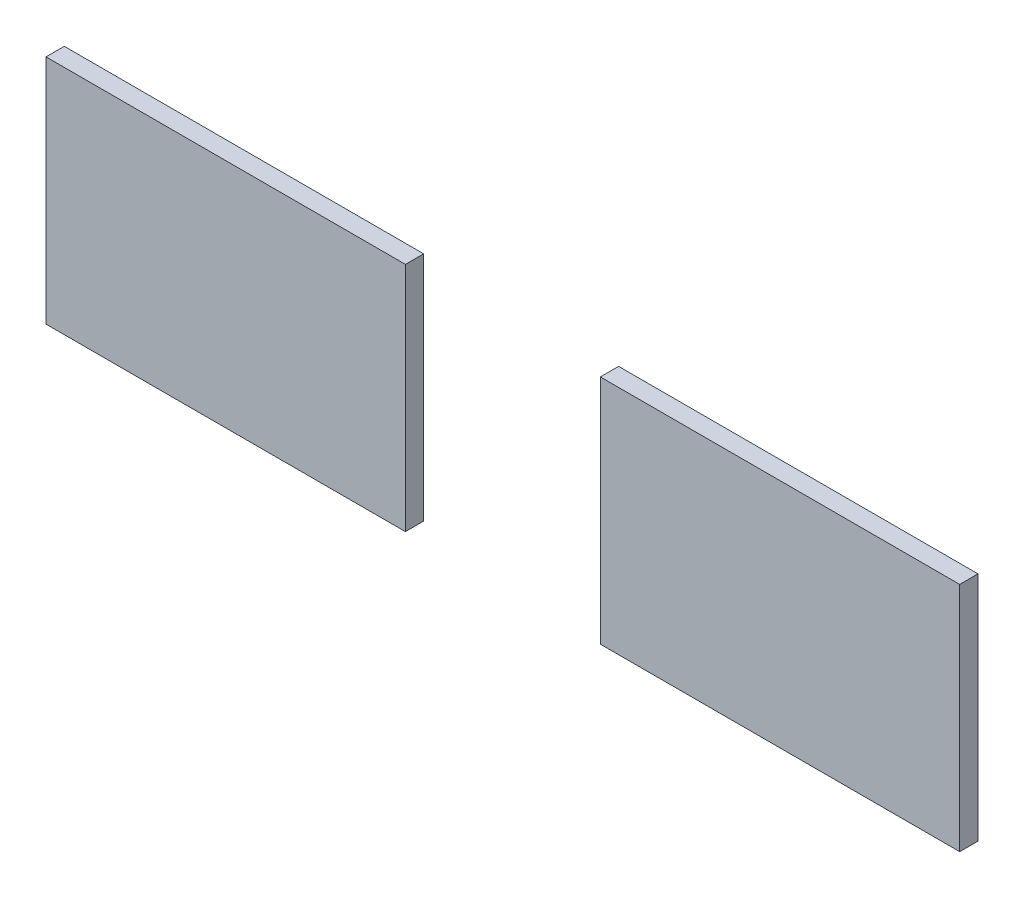
ISO-10303-21;
HEADER;
FILE_DESCRIPTION(('STEP AP214'),'2;1');
FILE_NAME('part.step','',(''),(''),'','','');
FILE_SCHEMA(('AUTOMOTIVE_DESIGN { 1 0 10303 214 1 1 1 1 }'));
ENDSEC;
DATA;
#1=APPLICATION_CONTEXT('core data for automotive mechanical design processes');
#2=APPLICATION_PROTOCOL_DEFINITION('international standard','automotive_design',2000,#1);
#3=PRODUCT_CONTEXT('',#1,'mechanical');
#4=PRODUCT('Part','Part','',(#3));
#5=PRODUCT_RELATED_PRODUCT_CATEGORY('part','',(#4));
#6=PRODUCT_DEFINITION_FORMATION('','',#4);
#7=PRODUCT_DEFINITION_CONTEXT('part definition',#1,'design');
#8=PRODUCT_DEFINITION('design','',#6,#7);
#9=PRODUCT_DEFINITION_SHAPE('','',#8);
#10=(LENGTH_UNIT() NAMED_UNIT(*) SI_UNIT(.MILLI.,.METRE.));
#11=(NAMED_UNIT(*) PLANE_ANGLE_UNIT() SI_UNIT($,.RADIAN.));
#12=(NAMED_UNIT(*) SI_UNIT($,.STERADIAN.) SOLID_ANGLE_UNIT());
#13=UNCERTAINTY_MEASURE_WITH_UNIT(LENGTH_MEASURE(1.E-05),#10,'distance_accuracy_value','');
#14=(GEOMETRIC_REPRESENTATION_CONTEXT(3) GLOBAL_UNCERTAINTY_ASSIGNED_CONTEXT((#13)) GLOBAL_UNIT_ASSIGNED_CONTEXT((#10,
#11,#12)) REPRESENTATION_CONTEXT('',''));
#15=CARTESIAN_POINT('',(0.,0.,0.));
#16=DIRECTION('',(0.,0.,1.));
#17=DIRECTION('',(1.,0.,0.));
#18=AXIS2_PLACEMENT_3D('',#15,#16,#17);
#19=CARTESIAN_POINT('',(-18.8636363636364,9.16666666666666,1.5));
#20=DIRECTION('',(1.,0.,0.));
#21=DIRECTION('',(0.,0.,-1.));
#22=AXIS2_PLACEMENT_3D('',#19,#20,#21);
#23=PLANE('',#22);
#24=DIRECTION('',(0.,-1.,0.));
#25=VECTOR('',#24,1.);
#26=CARTESIAN_POINT('',(-18.8636363636364,9.16666666666666,0.));
#27=LINE('',#26,#25);
#28=CARTESIAN_POINT('',(-18.8636363636364,9.16666666666666,0.));
#29=VERTEX_POINT('',#28);
#30=CARTESIAN_POINT('',(-18.8636363636364,-9.83333333333334,0.));
#31=VERTEX_POINT('',#30);
#32=EDGE_CURVE('E107',#29,#31,#27,.T.);
#33=ORIENTED_EDGE('',*,*,#32,.T.);
#34=DIRECTION('',(0.,0.,-1.));
#35=VECTOR('',#34,1.);
#36=CARTESIAN_POINT('',(-18.8636363636364,-9.83333333333334,1.5));
#37=LINE('',#36,#35);
#38=CARTESIAN_POINT('',(-18.8636363636364,-9.83333333333334,1.5));
#39=VERTEX_POINT('',#38);
#40=EDGE_CURVE('E12',#39,#31,#37,.T.);
#41=ORIENTED_EDGE('',*,*,#40,.F.);
#42=DIRECTION('',(0.,-1.,0.));
#43=VECTOR('',#42,1.);
#44=CARTESIAN_POINT('',(-18.8636363636364,9.16666666666666,1.5));
#45=LINE('',#44,#43);
#46=CARTESIAN_POINT('',(-18.8636363636364,9.16666666666666,1.5));
#47=VERTEX_POINT('',#46);
#48=EDGE_CURVE('E95',#47,#39,#45,.T.);
#49=ORIENTED_EDGE('',*,*,#48,.F.);
#50=DIRECTION('',(0.,0.,-1.));
#51=VECTOR('',#50,1.);
#52=CARTESIAN_POINT('',(-18.8636363636364,9.16666666666666,1.5));
#53=LINE('',#52,#51);
#54=EDGE_CURVE('E103',#47,#29,#53,.T.);
#55=ORIENTED_EDGE('',*,*,#54,.T.);
#56=EDGE_LOOP('',(#33,#41,#49,#55));
#57=FACE_BOUND('',#56,.T.);
#58=ADVANCED_FACE('F44',(#57),#23,.F.);
#59=CARTESIAN_POINT('',(-18.8636363636364,-9.83333333333334,1.5));
#60=DIRECTION('',(0.,1.,0.));
#61=DIRECTION('',(-1.,0.,0.));
#62=AXIS2_PLACEMENT_3D('',#59,#60,#61);
#63=PLANE('',#62);
#64=DIRECTION('',(1.,0.,0.));
#65=VECTOR('',#64,1.);
#66=CARTESIAN_POINT('',(-18.8636363636364,-9.83333333333334,0.));
#67=LINE('',#66,#65);
#68=CARTESIAN_POINT('',(10.6363636363636,-9.83333333333334,0.));
#69=VERTEX_POINT('',#68);
#70=EDGE_CURVE('E99',#31,#69,#67,.T.);
#71=ORIENTED_EDGE('',*,*,#70,.T.);
#72=DIRECTION('',(0.,0.,-1.));
#73=VECTOR('',#72,1.);
#74=CARTESIAN_POINT('',(10.6363636363636,-9.83333333333334,1.5));
#75=LINE('',#74,#73);
#76=CARTESIAN_POINT('',(10.6363636363636,-9.83333333333334,1.5));
#77=VERTEX_POINT('',#76);
#78=EDGE_CURVE('E52',#77,#69,#75,.T.);
#79=ORIENTED_EDGE('',*,*,#78,.F.);
#80=DIRECTION('',(1.,0.,0.));
#81=VECTOR('',#80,1.);
#82=CARTESIAN_POINT('',(-18.8636363636364,-9.83333333333334,1.5));
#83=LINE('',#82,#81);
#84=EDGE_CURVE('E90',#39,#77,#83,.T.);
#85=ORIENTED_EDGE('',*,*,#84,.F.);
#86=ORIENTED_EDGE('',*,*,#40,.T.);
#87=EDGE_LOOP('',(#71,#79,#85,#86));
#88=FACE_BOUND('',#87,.T.);
#89=ADVANCED_FACE('F98',(#88),#63,.F.);
#90=CARTESIAN_POINT('',(10.6363636363636,9.16666666666666,1.5));
#91=DIRECTION('',(-1.,0.,0.));
#92=DIRECTION('',(0.,0.,1.));
#93=AXIS2_PLACEMENT_3D('',#90,#91,#92);
#94=PLANE('',#93);
#95=DIRECTION('',(0.,1.,0.));
#96=VECTOR('',#95,1.);
#97=CARTESIAN_POINT('',(10.6363636363636,9.16666666666666,0.));
#98=LINE('',#97,#96);
#99=CARTESIAN_POINT('',(10.6363636363636,9.16666666666666,0.));
#100=VERTEX_POINT('',#99);
#101=EDGE_CURVE('E77',#69,#100,#98,.T.);
#102=ORIENTED_EDGE('',*,*,#101,.T.);
#103=DIRECTION('',(0.,0.,-1.));
#104=VECTOR('',#103,1.);
#105=CARTESIAN_POINT('',(10.6363636363636,9.16666666666666,1.5));
#106=LINE('',#105,#104);
#107=CARTESIAN_POINT('',(10.6363636363636,9.16666666666666,1.5));
#108=VERTEX_POINT('',#107);
#109=EDGE_CURVE('E100',#108,#100,#106,.T.);
#110=ORIENTED_EDGE('',*,*,#109,.F.);
#111=DIRECTION('',(0.,1.,0.));
#112=VECTOR('',#111,1.);
#113=CARTESIAN_POINT('',(10.6363636363636,9.16666666666666,1.5));
#114=LINE('',#113,#112);
#115=EDGE_CURVE('E93',#77,#108,#114,.T.);
#116=ORIENTED_EDGE('',*,*,#115,.F.);
#117=ORIENTED_EDGE('',*,*,#78,.T.);
#118=EDGE_LOOP('',(#102,#110,#116,#117));
#119=FACE_BOUND('',#118,.T.);
#120=ADVANCED_FACE('F101',(#119),#94,.F.);
#121=CARTESIAN_POINT('',(-18.8636363636364,9.16666666666666,1.5));
#122=DIRECTION('',(0.,-1.,0.));
#123=DIRECTION('',(0.,0.,-1.));
#124=AXIS2_PLACEMENT_3D('',#121,#122,#123);
#125=PLANE('',#124);
#126=DIRECTION('',(-1.,0.,0.));
#127=VECTOR('',#126,1.);
#128=CARTESIAN_POINT('',(-18.8636363636364,9.16666666666666,0.));
#129=LINE('',#128,#127);
#130=EDGE_CURVE('E83',#100,#29,#129,.T.);
#131=ORIENTED_EDGE('',*,*,#130,.T.);
#132=ORIENTED_EDGE('',*,*,#54,.F.);
#133=DIRECTION('',(-1.,0.,0.));
#134=VECTOR('',#133,1.);
#135=CARTESIAN_POINT('',(-18.8636363636364,9.16666666666666,1.5));
#136=LINE('',#135,#134);
#137=EDGE_CURVE('E60',#108,#47,#136,.T.);
#138=ORIENTED_EDGE('',*,*,#137,.F.);
#139=ORIENTED_EDGE('',*,*,#109,.T.);
#140=EDGE_LOOP('',(#131,#132,#138,#139));
#141=FACE_BOUND('',#140,.T.);
#142=ADVANCED_FACE('F114',(#141),#125,.F.);
#143=CARTESIAN_POINT('',(0.,0.,1.5));
#144=DIRECTION('',(0.,0.,1.));
#145=DIRECTION('',(1.,0.,0.));
#146=AXIS2_PLACEMENT_3D('',#143,#144,#145);
#147=PLANE('',#146);
#148=ORIENTED_EDGE('',*,*,#48,.T.);
#149=ORIENTED_EDGE('',*,*,#84,.T.);
#150=ORIENTED_EDGE('',*,*,#115,.T.);
#151=ORIENTED_EDGE('',*,*,#137,.T.);
#152=EDGE_LOOP('',(#148,#149,#150,#151));
#153=FACE_BOUND('',#152,.T.);
#154=ADVANCED_FACE('F91',(#153),#147,.T.);
#155=CARTESIAN_POINT('',(0.,0.,0.));
#156=DIRECTION('',(0.,0.,1.));
#157=DIRECTION('',(1.,0.,0.));
#158=AXIS2_PLACEMENT_3D('',#155,#156,#157);
#159=PLANE('',#158);
#160=ORIENTED_EDGE('',*,*,#32,.F.);
#161=ORIENTED_EDGE('',*,*,#130,.F.);
#162=ORIENTED_EDGE('',*,*,#101,.F.);
#163=ORIENTED_EDGE('',*,*,#70,.F.);
#164=EDGE_LOOP('',(#160,#161,#162,#163));
#165=FACE_BOUND('',#164,.T.);
#166=ADVANCED_FACE('F117',(#165),#159,.F.);
#167=CLOSED_SHELL('',(#58,#89,#120,#142,#154,#166));
#168=MANIFOLD_SOLID_BREP('B2',#167);
#169=CARTESIAN_POINT('',(-64.3636363636364,9.16666666666666,1.5));
#170=DIRECTION('',(1.,0.,0.));
#171=DIRECTION('',(0.,0.,-1.));
#172=AXIS2_PLACEMENT_3D('',#169,#170,#171);
#173=PLANE('',#172);
#174=DIRECTION('',(0.,-1.,0.));
#175=VECTOR('',#174,1.);
#176=CARTESIAN_POINT('',(-64.3636363636364,9.16666666666666,0.));
#177=LINE('',#176,#175);
#178=CARTESIAN_POINT('',(-64.3636363636364,9.16666666666666,0.));
#179=VERTEX_POINT('',#178);
#180=CARTESIAN_POINT('',(-64.3636363636364,-9.83333333333334,0.));
#181=VERTEX_POINT('',#180);
#182=EDGE_CURVE('E230',#179,#181,#177,.T.);
#183=ORIENTED_EDGE('',*,*,#182,.T.);
#184=DIRECTION('',(0.,0.,-1.));
#185=VECTOR('',#184,1.);
#186=CARTESIAN_POINT('',(-64.3636363636364,-9.83333333333334,1.5));
#187=LINE('',#186,#185);
#188=CARTESIAN_POINT('',(-64.3636363636364,-9.83333333333334,1.5));
#189=VERTEX_POINT('',#188);
#190=EDGE_CURVE('E42',#189,#181,#187,.T.);
#191=ORIENTED_EDGE('',*,*,#190,.F.);
#192=DIRECTION('',(0.,-1.,0.));
#193=VECTOR('',#192,1.);
#194=CARTESIAN_POINT('',(-64.3636363636364,9.16666666666666,1.5));
#195=LINE('',#194,#193);
#196=CARTESIAN_POINT('',(-64.3636363636364,9.16666666666666,1.5));
#197=VERTEX_POINT('',#196);
#198=EDGE_CURVE('E218',#197,#189,#195,.T.);
#199=ORIENTED_EDGE('',*,*,#198,.F.);
#200=DIRECTION('',(0.,0.,-1.));
#201=VECTOR('',#200,1.);
#202=CARTESIAN_POINT('',(-64.3636363636364,9.16666666666666,1.5));
#203=LINE('',#202,#201);
#204=EDGE_CURVE('E226',#197,#179,#203,.T.);
#205=ORIENTED_EDGE('',*,*,#204,.T.);
#206=EDGE_LOOP('',(#183,#191,#199,#205));
#207=FACE_BOUND('',#206,.T.);
#208=ADVANCED_FACE('F167',(#207),#173,.F.);
#209=CARTESIAN_POINT('',(-64.3636363636364,-9.83333333333334,1.5));
#210=DIRECTION('',(0.,1.,0.));
#211=DIRECTION('',(0.,0.,1.));
#212=AXIS2_PLACEMENT_3D('',#209,#210,#211);
#213=PLANE('',#212);
#214=DIRECTION('',(1.,0.,0.));
#215=VECTOR('',#214,1.);
#216=CARTESIAN_POINT('',(-64.3636363636364,-9.83333333333334,0.));
#217=LINE('',#216,#215);
#218=CARTESIAN_POINT('',(-34.8636363636364,-9.83333333333334,0.));
#219=VERTEX_POINT('',#218);
#220=EDGE_CURVE('E222',#181,#219,#217,.T.);
#221=ORIENTED_EDGE('',*,*,#220,.T.);
#222=DIRECTION('',(0.,0.,-1.));
#223=VECTOR('',#222,1.);
#224=CARTESIAN_POINT('',(-34.8636363636364,-9.83333333333334,1.5));
#225=LINE('',#224,#223);
#226=CARTESIAN_POINT('',(-34.8636363636364,-9.83333333333334,1.5));
#227=VERTEX_POINT('',#226);
#228=EDGE_CURVE('E175',#227,#219,#225,.T.);
#229=ORIENTED_EDGE('',*,*,#228,.F.);
#230=DIRECTION('',(1.,0.,0.));
#231=VECTOR('',#230,1.);
#232=CARTESIAN_POINT('',(-64.3636363636364,-9.83333333333334,1.5));
#233=LINE('',#232,#231);
#234=EDGE_CURVE('E213',#189,#227,#233,.T.);
#235=ORIENTED_EDGE('',*,*,#234,.F.);
#236=ORIENTED_EDGE('',*,*,#190,.T.);
#237=EDGE_LOOP('',(#221,#229,#235,#236));
#238=FACE_BOUND('',#237,.T.);
#239=ADVANCED_FACE('F221',(#238),#213,.F.);
#240=CARTESIAN_POINT('',(-34.8636363636364,9.16666666666666,1.5));
#241=DIRECTION('',(-1.,0.,0.));
#242=DIRECTION('',(0.,0.,1.));
#243=AXIS2_PLACEMENT_3D('',#240,#241,#242);
#244=PLANE('',#243);
#245=DIRECTION('',(0.,1.,0.));
#246=VECTOR('',#245,1.);
#247=CARTESIAN_POINT('',(-34.8636363636364,9.16666666666666,0.));
#248=LINE('',#247,#246);
#249=CARTESIAN_POINT('',(-34.8636363636364,9.16666666666666,0.));
#250=VERTEX_POINT('',#249);
#251=EDGE_CURVE('E200',#219,#250,#248,.T.);
#252=ORIENTED_EDGE('',*,*,#251,.T.);
#253=DIRECTION('',(0.,0.,-1.));
#254=VECTOR('',#253,1.);
#255=CARTESIAN_POINT('',(-34.8636363636364,9.16666666666666,1.5));
#256=LINE('',#255,#254);
#257=CARTESIAN_POINT('',(-34.8636363636364,9.16666666666666,1.5));
#258=VERTEX_POINT('',#257);
#259=EDGE_CURVE('E223',#258,#250,#256,.T.);
#260=ORIENTED_EDGE('',*,*,#259,.F.);
#261=DIRECTION('',(0.,1.,0.));
#262=VECTOR('',#261,1.);
#263=CARTESIAN_POINT('',(-34.8636363636364,9.16666666666666,1.5));
#264=LINE('',#263,#262);
#265=EDGE_CURVE('E216',#227,#258,#264,.T.);
#266=ORIENTED_EDGE('',*,*,#265,.F.);
#267=ORIENTED_EDGE('',*,*,#228,.T.);
#268=EDGE_LOOP('',(#252,#260,#266,#267));
#269=FACE_BOUND('',#268,.T.);
#270=ADVANCED_FACE('F224',(#269),#244,.F.);
#271=CARTESIAN_POINT('',(-64.3636363636364,9.16666666666666,1.5));
#272=DIRECTION('',(0.,-1.,0.));
#273=DIRECTION('',(0.,0.,-1.));
#274=AXIS2_PLACEMENT_3D('',#271,#272,#273);
#275=PLANE('',#274);
#276=DIRECTION('',(-1.,0.,0.));
#277=VECTOR('',#276,1.);
#278=CARTESIAN_POINT('',(-64.3636363636364,9.16666666666666,0.));
#279=LINE('',#278,#277);
#280=EDGE_CURVE('E206',#250,#179,#279,.T.);
#281=ORIENTED_EDGE('',*,*,#280,.T.);
#282=ORIENTED_EDGE('',*,*,#204,.F.);
#283=DIRECTION('',(-1.,0.,0.));
#284=VECTOR('',#283,1.);
#285=CARTESIAN_POINT('',(-64.3636363636364,9.16666666666666,1.5));
#286=LINE('',#285,#284);
#287=EDGE_CURVE('E183',#258,#197,#286,.T.);
#288=ORIENTED_EDGE('',*,*,#287,.F.);
#289=ORIENTED_EDGE('',*,*,#259,.T.);
#290=EDGE_LOOP('',(#281,#282,#288,#289));
#291=FACE_BOUND('',#290,.T.);
#292=ADVANCED_FACE('F237',(#291),#275,.F.);
#293=CARTESIAN_POINT('',(0.,0.,1.5));
#294=DIRECTION('',(0.,0.,1.));
#295=DIRECTION('',(1.,0.,0.));
#296=AXIS2_PLACEMENT_3D('',#293,#294,#295);
#297=PLANE('',#296);
#298=ORIENTED_EDGE('',*,*,#198,.T.);
#299=ORIENTED_EDGE('',*,*,#234,.T.);
#300=ORIENTED_EDGE('',*,*,#265,.T.);
#301=ORIENTED_EDGE('',*,*,#287,.T.);
#302=EDGE_LOOP('',(#298,#299,#300,#301));
#303=FACE_BOUND('',#302,.T.);
#304=ADVANCED_FACE('F214',(#303),#297,.T.);
#305=CARTESIAN_POINT('',(0.,0.,0.));
#306=DIRECTION('',(0.,0.,1.));
#307=DIRECTION('',(1.,0.,0.));
#308=AXIS2_PLACEMENT_3D('',#305,#306,#307);
#309=PLANE('',#308);
#310=ORIENTED_EDGE('',*,*,#182,.F.);
#311=ORIENTED_EDGE('',*,*,#280,.F.);
#312=ORIENTED_EDGE('',*,*,#251,.F.);
#313=ORIENTED_EDGE('',*,*,#220,.F.);
#314=EDGE_LOOP('',(#310,#311,#312,#313));
#315=FACE_BOUND('',#314,.T.);
#316=ADVANCED_FACE('F240',(#315),#309,.F.);
#317=CLOSED_SHELL('',(#208,#239,#270,#292,#304,#316));
#318=MANIFOLD_SOLID_BREP('B6',#317);
#319=ADVANCED_BREP_SHAPE_REPRESENTATION('',(#18,#168,#318),#14);
#320=SHAPE_DEFINITION_REPRESENTATION(#9,#319);
ENDSEC;
END-ISO-10303-21;
